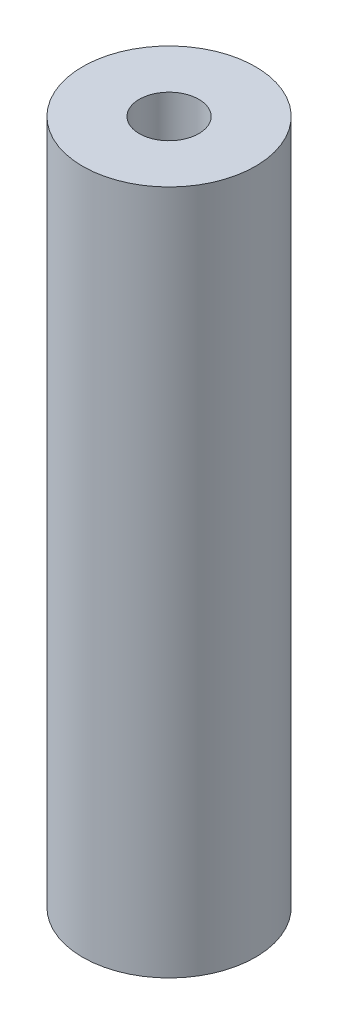
ISO-10303-21;
HEADER;
FILE_DESCRIPTION(('STEP AP214'),'2;1');
FILE_NAME('part.step','',(''),(''),'','','');
FILE_SCHEMA(('AUTOMOTIVE_DESIGN { 1 0 10303 214 1 1 1 1 }'));
ENDSEC;
DATA;
#1=APPLICATION_CONTEXT('core data for automotive mechanical design processes');
#2=APPLICATION_PROTOCOL_DEFINITION('international standard','automotive_design',2000,#1);
#3=PRODUCT_CONTEXT('',#1,'mechanical');
#4=PRODUCT('Part','Part','',(#3));
#5=PRODUCT_RELATED_PRODUCT_CATEGORY('part','',(#4));
#6=PRODUCT_DEFINITION_FORMATION('','',#4);
#7=PRODUCT_DEFINITION_CONTEXT('part definition',#1,'design');
#8=PRODUCT_DEFINITION('design','',#6,#7);
#9=PRODUCT_DEFINITION_SHAPE('','',#8);
#10=(LENGTH_UNIT() NAMED_UNIT(*) SI_UNIT(.MILLI.,.METRE.));
#11=(NAMED_UNIT(*) PLANE_ANGLE_UNIT() SI_UNIT($,.RADIAN.));
#12=(NAMED_UNIT(*) SI_UNIT($,.STERADIAN.) SOLID_ANGLE_UNIT());
#13=UNCERTAINTY_MEASURE_WITH_UNIT(LENGTH_MEASURE(1.E-05),#10,'distance_accuracy_value','');
#14=(GEOMETRIC_REPRESENTATION_CONTEXT(3) GLOBAL_UNCERTAINTY_ASSIGNED_CONTEXT((#13)) GLOBAL_UNIT_ASSIGNED_CONTEXT((#10,
#11,#12)) REPRESENTATION_CONTEXT('',''));
#15=CARTESIAN_POINT('',(0.,0.,0.));
#16=DIRECTION('',(0.,0.,1.));
#17=DIRECTION('',(1.,0.,0.));
#18=AXIS2_PLACEMENT_3D('',#15,#16,#17);
#19=CARTESIAN_POINT('',(0.,292.1,0.));
#20=DIRECTION('',(0.,1.,0.));
#21=DIRECTION('',(0.,0.,1.));
#22=AXIS2_PLACEMENT_3D('',#19,#20,#21);
#23=PLANE('',#22);
#24=CARTESIAN_POINT('',(0.,292.1,0.));
#25=DIRECTION('',(0.,1.,0.));
#26=DIRECTION('',(0.,0.,1.));
#27=AXIS2_PLACEMENT_3D('',#24,#25,#26);
#28=CIRCLE('',#27,36.83);
#29=CARTESIAN_POINT('',(0.,292.1,36.83));
#30=VERTEX_POINT('',#29);
#31=EDGE_CURVE('E10',#30,#30,#28,.T.);
#32=ORIENTED_EDGE('',*,*,#31,.T.);
#33=EDGE_LOOP('',(#32));
#34=FACE_BOUND('',#33,.T.);
#35=CARTESIAN_POINT('',(0.,292.1,0.));
#36=DIRECTION('',(0.,1.,0.));
#37=DIRECTION('',(0.,0.,1.));
#38=AXIS2_PLACEMENT_3D('',#35,#36,#37);
#39=CIRCLE('',#38,12.7);
#40=CARTESIAN_POINT('',(0.,292.1,12.7));
#41=VERTEX_POINT('',#40);
#42=EDGE_CURVE('E41',#41,#41,#39,.T.);
#43=ORIENTED_EDGE('',*,*,#42,.F.);
#44=EDGE_LOOP('',(#43));
#45=FACE_BOUND('',#44,.T.);
#46=ADVANCED_FACE('F30',(#34,#45),#23,.T.);
#47=CARTESIAN_POINT('',(0.,0.,0.));
#48=DIRECTION('',(0.,1.,0.));
#49=DIRECTION('',(0.,0.,1.));
#50=AXIS2_PLACEMENT_3D('',#47,#48,#49);
#51=PLANE('',#50);
#52=CARTESIAN_POINT('',(0.,0.,0.));
#53=DIRECTION('',(0.,1.,0.));
#54=DIRECTION('',(0.,0.,1.));
#55=AXIS2_PLACEMENT_3D('',#52,#53,#54);
#56=CIRCLE('',#55,36.83);
#57=CARTESIAN_POINT('',(0.,0.,36.83));
#58=VERTEX_POINT('',#57);
#59=EDGE_CURVE('E34',#58,#58,#56,.T.);
#60=ORIENTED_EDGE('',*,*,#59,.F.);
#61=EDGE_LOOP('',(#60));
#62=FACE_BOUND('',#61,.T.);
#63=CARTESIAN_POINT('',(0.,0.,0.));
#64=DIRECTION('',(0.,1.,0.));
#65=DIRECTION('',(0.,0.,1.));
#66=AXIS2_PLACEMENT_3D('',#63,#64,#65);
#67=CIRCLE('',#66,12.7);
#68=CARTESIAN_POINT('',(0.,0.,12.7));
#69=VERTEX_POINT('',#68);
#70=EDGE_CURVE('E43',#69,#69,#67,.T.);
#71=ORIENTED_EDGE('',*,*,#70,.T.);
#72=EDGE_LOOP('',(#71));
#73=FACE_BOUND('',#72,.T.);
#74=ADVANCED_FACE('F53',(#62,#73),#51,.F.);
#75=CARTESIAN_POINT('',(0.,292.1,0.));
#76=DIRECTION('',(0.,-1.,0.));
#77=DIRECTION('',(0.,0.,-1.));
#78=AXIS2_PLACEMENT_3D('',#75,#76,#77);
#79=CYLINDRICAL_SURFACE('',#78,36.83);
#80=ORIENTED_EDGE('',*,*,#31,.F.);
#81=EDGE_LOOP('',(#80));
#82=FACE_BOUND('',#81,.T.);
#83=ORIENTED_EDGE('',*,*,#59,.T.);
#84=EDGE_LOOP('',(#83));
#85=FACE_BOUND('',#84,.T.);
#86=ADVANCED_FACE('F32',(#82,#85),#79,.T.);
#87=CARTESIAN_POINT('',(0.,292.1,0.));
#88=DIRECTION('',(0.,-1.,0.));
#89=DIRECTION('',(0.,0.,-1.));
#90=AXIS2_PLACEMENT_3D('',#87,#88,#89);
#91=CYLINDRICAL_SURFACE('',#90,12.7);
#92=ORIENTED_EDGE('',*,*,#42,.T.);
#93=EDGE_LOOP('',(#92));
#94=FACE_BOUND('',#93,.T.);
#95=ORIENTED_EDGE('',*,*,#70,.F.);
#96=EDGE_LOOP('',(#95));
#97=FACE_BOUND('',#96,.T.);
#98=ADVANCED_FACE('F49',(#94,#97),#91,.F.);
#99=CLOSED_SHELL('',(#46,#74,#86,#98));
#100=MANIFOLD_SOLID_BREP('B2',#99);
#101=ADVANCED_BREP_SHAPE_REPRESENTATION('',(#18,#100),#14);
#102=SHAPE_DEFINITION_REPRESENTATION(#9,#101);
ENDSEC;
END-ISO-10303-21;
